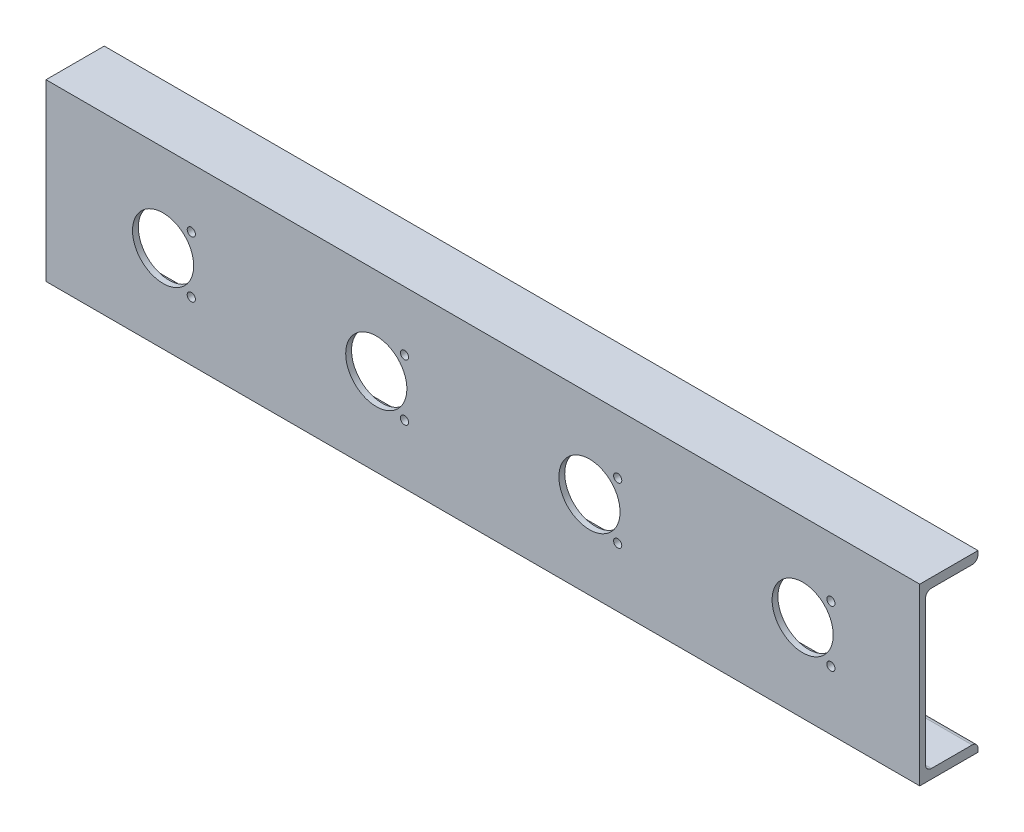
ISO-10303-21;
HEADER;
FILE_DESCRIPTION(('STEP AP214'),'2;1');
FILE_NAME('part.step','',(''),(''),'','','');
FILE_SCHEMA(('AUTOMOTIVE_DESIGN { 1 0 10303 214 1 1 1 1 }'));
ENDSEC;
DATA;
#1=APPLICATION_CONTEXT('core data for automotive mechanical design processes');
#2=APPLICATION_PROTOCOL_DEFINITION('international standard','automotive_design',2000,#1);
#3=PRODUCT_CONTEXT('',#1,'mechanical');
#4=PRODUCT('Part','Part','',(#3));
#5=PRODUCT_RELATED_PRODUCT_CATEGORY('part','',(#4));
#6=PRODUCT_DEFINITION_FORMATION('','',#4);
#7=PRODUCT_DEFINITION_CONTEXT('part definition',#1,'design');
#8=PRODUCT_DEFINITION('design','',#6,#7);
#9=PRODUCT_DEFINITION_SHAPE('','',#8);
#10=(LENGTH_UNIT() NAMED_UNIT(*) SI_UNIT(.MILLI.,.METRE.));
#11=(NAMED_UNIT(*) PLANE_ANGLE_UNIT() SI_UNIT($,.RADIAN.));
#12=(NAMED_UNIT(*) SI_UNIT($,.STERADIAN.) SOLID_ANGLE_UNIT());
#13=UNCERTAINTY_MEASURE_WITH_UNIT(LENGTH_MEASURE(1.E-05),#10,'distance_accuracy_value','');
#14=(GEOMETRIC_REPRESENTATION_CONTEXT(3) GLOBAL_UNCERTAINTY_ASSIGNED_CONTEXT((#13)) GLOBAL_UNIT_ASSIGNED_CONTEXT((#10,
#11,#12)) REPRESENTATION_CONTEXT('',''));
#15=CARTESIAN_POINT('',(0.,0.,0.));
#16=DIRECTION('',(0.,0.,1.));
#17=DIRECTION('',(1.,0.,0.));
#18=AXIS2_PLACEMENT_3D('',#15,#16,#17);
#19=CARTESIAN_POINT('',(201.,-36.1204013377926,206.622073578595));
#20=DIRECTION('',(0.,0.,-1.));
#21=DIRECTION('',(0.,1.,0.));
#22=AXIS2_PLACEMENT_3D('',#19,#20,#21);
#23=CYLINDRICAL_SURFACE('',#22,52.4999999999999);
#24=CARTESIAN_POINT('',(201.,-36.1204013377926,176.622073578595));
#25=DIRECTION('',(0.,0.,-1.));
#26=DIRECTION('',(0.,1.,0.));
#27=AXIS2_PLACEMENT_3D('',#24,#25,#26);
#28=CIRCLE('',#27,52.4999999999999);
#29=CARTESIAN_POINT('',(201.,16.3795986622073,176.622073578595));
#30=VERTEX_POINT('',#29);
#31=EDGE_CURVE('E44',#30,#30,#28,.T.);
#32=ORIENTED_EDGE('',*,*,#31,.T.);
#33=EDGE_LOOP('',(#32));
#34=FACE_BOUND('',#33,.T.);
#35=CARTESIAN_POINT('',(201.,-36.1204013377926,186.622073578595));
#36=DIRECTION('',(0.,0.,-1.));
#37=DIRECTION('',(-1.,0.,0.));
#38=AXIS2_PLACEMENT_3D('',#35,#36,#37);
#39=CIRCLE('',#38,52.4999999999999);
#40=CARTESIAN_POINT('',(148.5,-36.1204013377926,186.622073578595));
#41=VERTEX_POINT('',#40);
#42=EDGE_CURVE('E11',#41,#41,#39,.T.);
#43=ORIENTED_EDGE('',*,*,#42,.F.);
#44=EDGE_LOOP('',(#43));
#45=FACE_BOUND('',#44,.T.);
#46=ADVANCED_FACE('F35',(#34,#45),#23,.F.);
#47=CARTESIAN_POINT('',(567.,-36.1204013377926,206.622073578595));
#48=DIRECTION('',(0.,0.,-1.));
#49=DIRECTION('',(0.,1.,0.));
#50=AXIS2_PLACEMENT_3D('',#47,#48,#49);
#51=CYLINDRICAL_SURFACE('',#50,52.4999999999999);
#52=CARTESIAN_POINT('',(567.,-36.1204013377926,176.622073578595));
#53=DIRECTION('',(0.,0.,-1.));
#54=DIRECTION('',(0.,1.,0.));
#55=AXIS2_PLACEMENT_3D('',#52,#53,#54);
#56=CIRCLE('',#55,52.4999999999999);
#57=CARTESIAN_POINT('',(567.,16.3795986622073,176.622073578595));
#58=VERTEX_POINT('',#57);
#59=EDGE_CURVE('E208',#58,#58,#56,.T.);
#60=ORIENTED_EDGE('',*,*,#59,.T.);
#61=EDGE_LOOP('',(#60));
#62=FACE_BOUND('',#61,.T.);
#63=CARTESIAN_POINT('',(567.,-36.1204013377926,186.622073578595));
#64=DIRECTION('',(0.,0.,-1.));
#65=DIRECTION('',(-1.,0.,0.));
#66=AXIS2_PLACEMENT_3D('',#63,#64,#65);
#67=CIRCLE('',#66,52.4999999999999);
#68=CARTESIAN_POINT('',(514.5,-36.1204013377926,186.622073578595));
#69=VERTEX_POINT('',#68);
#70=EDGE_CURVE('E211',#69,#69,#67,.T.);
#71=ORIENTED_EDGE('',*,*,#70,.F.);
#72=EDGE_LOOP('',(#71));
#73=FACE_BOUND('',#72,.T.);
#74=ADVANCED_FACE('F314',(#62,#73),#51,.F.);
#75=CARTESIAN_POINT('',(1500.,107.879598662207,86.6220735785954));
#76=DIRECTION('',(0.,0.,1.));
#77=DIRECTION('',(1.,0.,0.));
#78=AXIS2_PLACEMENT_3D('',#75,#76,#77);
#79=PLANE('',#78);
#80=DIRECTION('',(0.,1.,0.));
#81=VECTOR('',#80,1.);
#82=CARTESIAN_POINT('',(0.,107.879598662207,86.6220735785954));
#83=LINE('',#82,#81);
#84=CARTESIAN_POINT('',(0.,107.879598662207,86.6220735785954));
#85=VERTEX_POINT('',#84);
#86=CARTESIAN_POINT('',(0.,113.879598662207,86.6220735785954));
#87=VERTEX_POINT('',#86);
#88=EDGE_CURVE('E158',#85,#87,#83,.T.);
#89=ORIENTED_EDGE('',*,*,#88,.T.);
#90=DIRECTION('',(-1.,0.,0.));
#91=VECTOR('',#90,1.);
#92=CARTESIAN_POINT('',(1500.,113.879598662207,86.6220735785954));
#93=LINE('',#92,#91);
#94=CARTESIAN_POINT('',(1500.,113.879598662207,86.6220735785954));
#95=VERTEX_POINT('',#94);
#96=EDGE_CURVE('E206',#95,#87,#93,.T.);
#97=ORIENTED_EDGE('',*,*,#96,.F.);
#98=DIRECTION('',(0.,1.,0.));
#99=VECTOR('',#98,1.);
#100=CARTESIAN_POINT('',(1500.,107.879598662207,86.6220735785954));
#101=LINE('',#100,#99);
#102=CARTESIAN_POINT('',(1500.,107.879598662207,86.6220735785954));
#103=VERTEX_POINT('',#102);
#104=EDGE_CURVE('E181',#103,#95,#101,.T.);
#105=ORIENTED_EDGE('',*,*,#104,.F.);
#106=DIRECTION('',(-1.,0.,0.));
#107=VECTOR('',#106,1.);
#108=CARTESIAN_POINT('',(1500.,107.879598662207,86.6220735785954));
#109=LINE('',#108,#107);
#110=EDGE_CURVE('E154',#103,#85,#109,.T.);
#111=ORIENTED_EDGE('',*,*,#110,.T.);
#112=EDGE_LOOP('',(#89,#97,#105,#111));
#113=FACE_BOUND('',#112,.T.);
#114=ADVANCED_FACE('F301',(#113),#79,.F.);
#115=CARTESIAN_POINT('',(1500.,113.879598662207,86.6220735785954));
#116=DIRECTION('',(0.,-1.,0.));
#117=DIRECTION('',(0.,0.,-1.));
#118=AXIS2_PLACEMENT_3D('',#115,#116,#117);
#119=PLANE('',#118);
#120=DIRECTION('',(0.,0.,1.));
#121=VECTOR('',#120,1.);
#122=CARTESIAN_POINT('',(0.,113.879598662207,86.6220735785954));
#123=LINE('',#122,#121);
#124=CARTESIAN_POINT('',(0.,113.879598662207,186.622073578595));
#125=VERTEX_POINT('',#124);
#126=EDGE_CURVE('E161',#87,#125,#123,.T.);
#127=ORIENTED_EDGE('',*,*,#126,.T.);
#128=DIRECTION('',(-1.,0.,0.));
#129=VECTOR('',#128,1.);
#130=CARTESIAN_POINT('',(1500.,113.879598662207,186.622073578595));
#131=LINE('',#130,#129);
#132=CARTESIAN_POINT('',(1500.,113.879598662207,186.622073578595));
#133=VERTEX_POINT('',#132);
#134=EDGE_CURVE('E203',#133,#125,#131,.T.);
#135=ORIENTED_EDGE('',*,*,#134,.F.);
#136=DIRECTION('',(0.,0.,1.));
#137=VECTOR('',#136,1.);
#138=CARTESIAN_POINT('',(1500.,113.879598662207,86.6220735785954));
#139=LINE('',#138,#137);
#140=EDGE_CURVE('E109',#95,#133,#139,.T.);
#141=ORIENTED_EDGE('',*,*,#140,.F.);
#142=ORIENTED_EDGE('',*,*,#96,.T.);
#143=EDGE_LOOP('',(#127,#135,#141,#142));
#144=FACE_BOUND('',#143,.T.);
#145=ADVANCED_FACE('F327',(#144),#119,.F.);
#146=CARTESIAN_POINT('',(1500.,113.879598662207,186.622073578595));
#147=DIRECTION('',(0.,0.,-1.));
#148=DIRECTION('',(-1.,0.,0.));
#149=AXIS2_PLACEMENT_3D('',#146,#147,#148);
#150=PLANE('',#149);
#151=CARTESIAN_POINT('',(249.436814511279,12.316413173486,186.622073578595));
#152=DIRECTION('',(0.,0.,-1.));
#153=DIRECTION('',(-1.,0.,0.));
#154=AXIS2_PLACEMENT_3D('',#151,#152,#153);
#155=CIRCLE('',#154,6.99999999999989);
#156=CARTESIAN_POINT('',(242.436814511279,12.316413173486,186.622073578595));
#157=VERTEX_POINT('',#156);
#158=EDGE_CURVE('E220',#157,#157,#155,.T.);
#159=ORIENTED_EDGE('',*,*,#158,.T.);
#160=EDGE_LOOP('',(#159));
#161=FACE_BOUND('',#160,.T.);
#162=CARTESIAN_POINT('',(615.436814511278,-84.5572158490712,186.622073578595));
#163=DIRECTION('',(0.,0.,-1.));
#164=DIRECTION('',(-1.,0.,0.));
#165=AXIS2_PLACEMENT_3D('',#162,#163,#164);
#166=CIRCLE('',#165,6.99999999999989);
#167=CARTESIAN_POINT('',(608.436814511279,-84.5572158490712,186.622073578595));
#168=VERTEX_POINT('',#167);
#169=EDGE_CURVE('E242',#168,#168,#166,.T.);
#170=ORIENTED_EDGE('',*,*,#169,.T.);
#171=EDGE_LOOP('',(#170));
#172=FACE_BOUND('',#171,.T.);
#173=CARTESIAN_POINT('',(615.436814511278,12.316413173486,186.622073578595));
#174=DIRECTION('',(0.,0.,-1.));
#175=DIRECTION('',(-1.,0.,0.));
#176=AXIS2_PLACEMENT_3D('',#173,#174,#175);
#177=CIRCLE('',#176,6.99999999999989);
#178=CARTESIAN_POINT('',(608.436814511279,12.316413173486,186.622073578595));
#179=VERTEX_POINT('',#178);
#180=EDGE_CURVE('E239',#179,#179,#177,.T.);
#181=ORIENTED_EDGE('',*,*,#180,.T.);
#182=EDGE_LOOP('',(#181));
#183=FACE_BOUND('',#182,.T.);
#184=CARTESIAN_POINT('',(981.436814511278,-84.5572158490712,186.622073578595));
#185=DIRECTION('',(0.,0.,-1.));
#186=DIRECTION('',(-1.,0.,0.));
#187=AXIS2_PLACEMENT_3D('',#184,#185,#186);
#188=CIRCLE('',#187,6.99999999999989);
#189=CARTESIAN_POINT('',(974.436814511279,-84.5572158490712,186.622073578595));
#190=VERTEX_POINT('',#189);
#191=EDGE_CURVE('E236',#190,#190,#188,.T.);
#192=ORIENTED_EDGE('',*,*,#191,.T.);
#193=EDGE_LOOP('',(#192));
#194=FACE_BOUND('',#193,.T.);
#195=CARTESIAN_POINT('',(249.436814511279,-84.5572158490712,186.622073578595));
#196=DIRECTION('',(0.,0.,-1.));
#197=DIRECTION('',(-1.,0.,0.));
#198=AXIS2_PLACEMENT_3D('',#195,#196,#197);
#199=CIRCLE('',#198,6.99999999999989);
#200=CARTESIAN_POINT('',(242.436814511279,-84.5572158490712,186.622073578595));
#201=VERTEX_POINT('',#200);
#202=EDGE_CURVE('E232',#201,#201,#199,.T.);
#203=ORIENTED_EDGE('',*,*,#202,.T.);
#204=EDGE_LOOP('',(#203));
#205=FACE_BOUND('',#204,.T.);
#206=CARTESIAN_POINT('',(981.436814511278,12.316413173486,186.622073578595));
#207=DIRECTION('',(0.,0.,-1.));
#208=DIRECTION('',(-1.,0.,0.));
#209=AXIS2_PLACEMENT_3D('',#206,#207,#208);
#210=CIRCLE('',#209,6.99999999999989);
#211=CARTESIAN_POINT('',(974.436814511279,12.316413173486,186.622073578595));
#212=VERTEX_POINT('',#211);
#213=EDGE_CURVE('E228',#212,#212,#210,.T.);
#214=ORIENTED_EDGE('',*,*,#213,.T.);
#215=EDGE_LOOP('',(#214));
#216=FACE_BOUND('',#215,.T.);
#217=CARTESIAN_POINT('',(1347.43681451128,12.316413173486,186.622073578595));
#218=DIRECTION('',(0.,0.,-1.));
#219=DIRECTION('',(-1.,0.,0.));
#220=AXIS2_PLACEMENT_3D('',#217,#218,#219);
#221=CIRCLE('',#220,6.99999999999989);
#222=CARTESIAN_POINT('',(1340.43681451128,12.316413173486,186.622073578595));
#223=VERTEX_POINT('',#222);
#224=EDGE_CURVE('E224',#223,#223,#221,.T.);
#225=ORIENTED_EDGE('',*,*,#224,.T.);
#226=EDGE_LOOP('',(#225));
#227=FACE_BOUND('',#226,.T.);
#228=CARTESIAN_POINT('',(1347.43681451128,-84.5572158490712,186.622073578595));
#229=DIRECTION('',(0.,0.,-1.));
#230=DIRECTION('',(-1.,0.,0.));
#231=AXIS2_PLACEMENT_3D('',#228,#229,#230);
#232=CIRCLE('',#231,6.99999999999989);
#233=CARTESIAN_POINT('',(1340.43681451128,-84.5572158490712,186.622073578595));
#234=VERTEX_POINT('',#233);
#235=EDGE_CURVE('E219',#234,#234,#232,.T.);
#236=ORIENTED_EDGE('',*,*,#235,.T.);
#237=EDGE_LOOP('',(#236));
#238=FACE_BOUND('',#237,.T.);
#239=CARTESIAN_POINT('',(933.,-36.1204013377926,186.622073578595));
#240=DIRECTION('',(0.,0.,-1.));
#241=DIRECTION('',(-1.,0.,0.));
#242=AXIS2_PLACEMENT_3D('',#239,#240,#241);
#243=CIRCLE('',#242,52.4999999999999);
#244=CARTESIAN_POINT('',(880.5,-36.1204013377926,186.622073578595));
#245=VERTEX_POINT('',#244);
#246=EDGE_CURVE('E263',#245,#245,#243,.T.);
#247=ORIENTED_EDGE('',*,*,#246,.T.);
#248=EDGE_LOOP('',(#247));
#249=FACE_BOUND('',#248,.T.);
#250=CARTESIAN_POINT('',(1299.,-36.1204013377926,186.622073578595));
#251=DIRECTION('',(0.,0.,-1.));
#252=DIRECTION('',(-1.,0.,0.));
#253=AXIS2_PLACEMENT_3D('',#250,#251,#252);
#254=CIRCLE('',#253,52.4999999999999);
#255=CARTESIAN_POINT('',(1246.5,-36.1204013377926,186.622073578595));
#256=VERTEX_POINT('',#255);
#257=EDGE_CURVE('E162',#256,#256,#254,.T.);
#258=ORIENTED_EDGE('',*,*,#257,.T.);
#259=EDGE_LOOP('',(#258));
#260=FACE_BOUND('',#259,.T.);
#261=DIRECTION('',(0.,-1.,0.));
#262=VECTOR('',#261,1.);
#263=CARTESIAN_POINT('',(0.,113.879598662207,186.622073578595));
#264=LINE('',#263,#262);
#265=CARTESIAN_POINT('',(0.,-186.120401337793,186.622073578595));
#266=VERTEX_POINT('',#265);
#267=EDGE_CURVE('E164',#125,#266,#264,.T.);
#268=ORIENTED_EDGE('',*,*,#267,.T.);
#269=DIRECTION('',(-1.,0.,0.));
#270=VECTOR('',#269,1.);
#271=CARTESIAN_POINT('',(1500.,-186.120401337793,186.622073578595));
#272=LINE('',#271,#270);
#273=CARTESIAN_POINT('',(1500.,-186.120401337793,186.622073578595));
#274=VERTEX_POINT('',#273);
#275=EDGE_CURVE('E200',#274,#266,#272,.T.);
#276=ORIENTED_EDGE('',*,*,#275,.F.);
#277=DIRECTION('',(0.,-1.,0.));
#278=VECTOR('',#277,1.);
#279=CARTESIAN_POINT('',(1500.,113.879598662207,186.622073578595));
#280=LINE('',#279,#278);
#281=EDGE_CURVE('E273',#133,#274,#280,.T.);
#282=ORIENTED_EDGE('',*,*,#281,.F.);
#283=ORIENTED_EDGE('',*,*,#134,.T.);
#284=EDGE_LOOP('',(#268,#276,#282,#283));
#285=FACE_BOUND('',#284,.T.);
#286=ORIENTED_EDGE('',*,*,#70,.T.);
#287=EDGE_LOOP('',(#286));
#288=FACE_BOUND('',#287,.T.);
#289=ORIENTED_EDGE('',*,*,#42,.T.);
#290=EDGE_LOOP('',(#289));
#291=FACE_BOUND('',#290,.T.);
#292=ADVANCED_FACE('F324',(#161,#172,#183,#194,#205,#216,#227,#238,#249,#260,#285,#288,#291),
#150,.F.);
#293=CARTESIAN_POINT('',(1500.,-186.120401337793,186.622073578595));
#294=DIRECTION('',(0.,1.,0.));
#295=DIRECTION('',(0.,0.,1.));
#296=AXIS2_PLACEMENT_3D('',#293,#294,#295);
#297=PLANE('',#296);
#298=DIRECTION('',(0.,0.,-1.));
#299=VECTOR('',#298,1.);
#300=CARTESIAN_POINT('',(0.,-186.120401337793,186.622073578595));
#301=LINE('',#300,#299);
#302=CARTESIAN_POINT('',(0.,-186.120401337793,86.6220735785954));
#303=VERTEX_POINT('',#302);
#304=EDGE_CURVE('E166',#266,#303,#301,.T.);
#305=ORIENTED_EDGE('',*,*,#304,.T.);
#306=DIRECTION('',(-1.,0.,0.));
#307=VECTOR('',#306,1.);
#308=CARTESIAN_POINT('',(1500.,-186.120401337793,86.6220735785954));
#309=LINE('',#308,#307);
#310=CARTESIAN_POINT('',(1500.,-186.120401337793,86.6220735785954));
#311=VERTEX_POINT('',#310);
#312=EDGE_CURVE('E197',#311,#303,#309,.T.);
#313=ORIENTED_EDGE('',*,*,#312,.F.);
#314=DIRECTION('',(0.,0.,-1.));
#315=VECTOR('',#314,1.);
#316=CARTESIAN_POINT('',(1500.,-186.120401337793,186.622073578595));
#317=LINE('',#316,#315);
#318=EDGE_CURVE('E275',#274,#311,#317,.T.);
#319=ORIENTED_EDGE('',*,*,#318,.F.);
#320=ORIENTED_EDGE('',*,*,#275,.T.);
#321=EDGE_LOOP('',(#305,#313,#319,#320));
#322=FACE_BOUND('',#321,.T.);
#323=ADVANCED_FACE('F326',(#322),#297,.F.);
#324=CARTESIAN_POINT('',(1500.,-186.120401337793,86.6220735785954));
#325=DIRECTION('',(0.,0.,1.));
#326=DIRECTION('',(1.,0.,0.));
#327=AXIS2_PLACEMENT_3D('',#324,#325,#326);
#328=PLANE('',#327);
#329=DIRECTION('',(0.,1.,0.));
#330=VECTOR('',#329,1.);
#331=CARTESIAN_POINT('',(0.,-186.120401337793,86.6220735785954));
#332=LINE('',#331,#330);
#333=CARTESIAN_POINT('',(0.,-180.120401337793,86.6220735785954));
#334=VERTEX_POINT('',#333);
#335=EDGE_CURVE('E168',#303,#334,#332,.T.);
#336=ORIENTED_EDGE('',*,*,#335,.T.);
#337=DIRECTION('',(-1.,0.,0.));
#338=VECTOR('',#337,1.);
#339=CARTESIAN_POINT('',(1500.,-180.120401337793,86.6220735785954));
#340=LINE('',#339,#338);
#341=CARTESIAN_POINT('',(1500.,-180.120401337793,86.6220735785954));
#342=VERTEX_POINT('',#341);
#343=EDGE_CURVE('E194',#342,#334,#340,.T.);
#344=ORIENTED_EDGE('',*,*,#343,.F.);
#345=DIRECTION('',(0.,1.,0.));
#346=VECTOR('',#345,1.);
#347=CARTESIAN_POINT('',(1500.,-186.120401337793,86.6220735785954));
#348=LINE('',#347,#346);
#349=EDGE_CURVE('E277',#311,#342,#348,.T.);
#350=ORIENTED_EDGE('',*,*,#349,.F.);
#351=ORIENTED_EDGE('',*,*,#312,.T.);
#352=EDGE_LOOP('',(#336,#344,#350,#351));
#353=FACE_BOUND('',#352,.T.);
#354=ADVANCED_FACE('F335',(#353),#328,.F.);
#355=CARTESIAN_POINT('',(1500.,-180.120401337793,96.6220735785954));
#356=DIRECTION('',(-1.,0.,0.));
#357=DIRECTION('',(0.,0.,1.));
#358=AXIS2_PLACEMENT_3D('',#355,#356,#357);
#359=CYLINDRICAL_SURFACE('',#358,10.);
#360=CARTESIAN_POINT('',(0.,-180.120401337793,96.6220735785954));
#361=DIRECTION('',(1.,0.,0.));
#362=DIRECTION('',(0.,0.,-1.));
#363=AXIS2_PLACEMENT_3D('',#360,#361,#362);
#364=CIRCLE('',#363,10.);
#365=CARTESIAN_POINT('',(0.,-170.120401337793,96.6220735785954));
#366=VERTEX_POINT('',#365);
#367=EDGE_CURVE('E170',#334,#366,#364,.T.);
#368=ORIENTED_EDGE('',*,*,#367,.T.);
#369=DIRECTION('',(-1.,0.,0.));
#370=VECTOR('',#369,1.);
#371=CARTESIAN_POINT('',(1500.,-170.120401337793,96.6220735785954));
#372=LINE('',#371,#370);
#373=CARTESIAN_POINT('',(1500.,-170.120401337793,96.6220735785954));
#374=VERTEX_POINT('',#373);
#375=EDGE_CURVE('E191',#374,#366,#372,.T.);
#376=ORIENTED_EDGE('',*,*,#375,.F.);
#377=CARTESIAN_POINT('',(1500.,-180.120401337793,96.6220735785954));
#378=DIRECTION('',(1.,0.,0.));
#379=DIRECTION('',(0.,0.,-1.));
#380=AXIS2_PLACEMENT_3D('',#377,#378,#379);
#381=CIRCLE('',#380,10.);
#382=EDGE_CURVE('E279',#342,#374,#381,.T.);
#383=ORIENTED_EDGE('',*,*,#382,.F.);
#384=ORIENTED_EDGE('',*,*,#343,.T.);
#385=EDGE_LOOP('',(#368,#376,#383,#384));
#386=FACE_BOUND('',#385,.T.);
#387=ADVANCED_FACE('F367',(#386),#359,.T.);
#388=CARTESIAN_POINT('',(1500.,-170.120401337793,96.6220735785954));
#389=DIRECTION('',(0.,-1.,0.));
#390=DIRECTION('',(0.,0.,-1.));
#391=AXIS2_PLACEMENT_3D('',#388,#389,#390);
#392=PLANE('',#391);
#393=DIRECTION('',(0.,0.,1.));
#394=VECTOR('',#393,1.);
#395=CARTESIAN_POINT('',(0.,-170.120401337793,96.6220735785954));
#396=LINE('',#395,#394);
#397=CARTESIAN_POINT('',(0.,-170.120401337793,166.622073578595));
#398=VERTEX_POINT('',#397);
#399=EDGE_CURVE('E172',#366,#398,#396,.T.);
#400=ORIENTED_EDGE('',*,*,#399,.T.);
#401=DIRECTION('',(-1.,0.,0.));
#402=VECTOR('',#401,1.);
#403=CARTESIAN_POINT('',(1500.,-170.120401337793,166.622073578595));
#404=LINE('',#403,#402);
#405=CARTESIAN_POINT('',(1500.,-170.120401337793,166.622073578595));
#406=VERTEX_POINT('',#405);
#407=EDGE_CURVE('E188',#406,#398,#404,.T.);
#408=ORIENTED_EDGE('',*,*,#407,.F.);
#409=DIRECTION('',(0.,0.,1.));
#410=VECTOR('',#409,1.);
#411=CARTESIAN_POINT('',(1500.,-170.120401337793,96.6220735785954));
#412=LINE('',#411,#410);
#413=EDGE_CURVE('E281',#374,#406,#412,.T.);
#414=ORIENTED_EDGE('',*,*,#413,.F.);
#415=ORIENTED_EDGE('',*,*,#375,.T.);
#416=EDGE_LOOP('',(#400,#408,#414,#415));
#417=FACE_BOUND('',#416,.T.);
#418=ADVANCED_FACE('F374',(#417),#392,.F.);
#419=CARTESIAN_POINT('',(1500.,-160.120401337793,166.622073578595));
#420=DIRECTION('',(-1.,0.,0.));
#421=DIRECTION('',(0.,0.,1.));
#422=AXIS2_PLACEMENT_3D('',#419,#420,#421);
#423=CYLINDRICAL_SURFACE('',#422,10.);
#424=CARTESIAN_POINT('',(0.,-160.120401337793,166.622073578595));
#425=DIRECTION('',(-1.,0.,0.));
#426=DIRECTION('',(0.,0.,1.));
#427=AXIS2_PLACEMENT_3D('',#424,#425,#426);
#428=CIRCLE('',#427,10.);
#429=CARTESIAN_POINT('',(0.,-160.120401337793,176.622073578595));
#430=VERTEX_POINT('',#429);
#431=EDGE_CURVE('E174',#398,#430,#428,.T.);
#432=ORIENTED_EDGE('',*,*,#431,.T.);
#433=DIRECTION('',(-1.,0.,0.));
#434=VECTOR('',#433,1.);
#435=CARTESIAN_POINT('',(1500.,-160.120401337793,176.622073578595));
#436=LINE('',#435,#434);
#437=CARTESIAN_POINT('',(1500.,-160.120401337793,176.622073578595));
#438=VERTEX_POINT('',#437);
#439=EDGE_CURVE('E185',#438,#430,#436,.T.);
#440=ORIENTED_EDGE('',*,*,#439,.F.);
#441=CARTESIAN_POINT('',(1500.,-160.120401337793,166.622073578595));
#442=DIRECTION('',(-1.,0.,0.));
#443=DIRECTION('',(0.,0.,1.));
#444=AXIS2_PLACEMENT_3D('',#441,#442,#443);
#445=CIRCLE('',#444,10.);
#446=EDGE_CURVE('E283',#406,#438,#445,.T.);
#447=ORIENTED_EDGE('',*,*,#446,.F.);
#448=ORIENTED_EDGE('',*,*,#407,.T.);
#449=EDGE_LOOP('',(#432,#440,#447,#448));
#450=FACE_BOUND('',#449,.T.);
#451=ADVANCED_FACE('F289',(#450),#423,.F.);
#452=CARTESIAN_POINT('',(1500.,-160.120401337793,176.622073578595));
#453=DIRECTION('',(0.,0.,1.));
#454=DIRECTION('',(0.,-1.,0.));
#455=AXIS2_PLACEMENT_3D('',#452,#453,#454);
#456=PLANE('',#455);
#457=CARTESIAN_POINT('',(249.436814511279,12.316413173486,176.622073578595));
#458=DIRECTION('',(0.,0.,1.));
#459=DIRECTION('',(0.,-1.,0.));
#460=AXIS2_PLACEMENT_3D('',#457,#458,#459);
#461=CIRCLE('',#460,6.99999999999989);
#462=CARTESIAN_POINT('',(249.436814511279,5.31641317348608,176.622073578595));
#463=VERTEX_POINT('',#462);
#464=EDGE_CURVE('E38',#463,#463,#461,.T.);
#465=ORIENTED_EDGE('',*,*,#464,.T.);
#466=EDGE_LOOP('',(#465));
#467=FACE_BOUND('',#466,.T.);
#468=CARTESIAN_POINT('',(615.436814511278,-84.5572158490712,176.622073578595));
#469=DIRECTION('',(0.,0.,1.));
#470=DIRECTION('',(0.,-1.,0.));
#471=AXIS2_PLACEMENT_3D('',#468,#469,#470);
#472=CIRCLE('',#471,6.99999999999989);
#473=CARTESIAN_POINT('',(615.436814511278,-91.5572158490711,176.622073578595));
#474=VERTEX_POINT('',#473);
#475=EDGE_CURVE('E240',#474,#474,#472,.T.);
#476=ORIENTED_EDGE('',*,*,#475,.T.);
#477=EDGE_LOOP('',(#476));
#478=FACE_BOUND('',#477,.T.);
#479=CARTESIAN_POINT('',(615.436814511278,12.316413173486,176.622073578595));
#480=DIRECTION('',(0.,0.,1.));
#481=DIRECTION('',(0.,-1.,0.));
#482=AXIS2_PLACEMENT_3D('',#479,#480,#481);
#483=CIRCLE('',#482,6.99999999999989);
#484=CARTESIAN_POINT('',(615.436814511278,5.31641317348608,176.622073578595));
#485=VERTEX_POINT('',#484);
#486=EDGE_CURVE('E237',#485,#485,#483,.T.);
#487=ORIENTED_EDGE('',*,*,#486,.T.);
#488=EDGE_LOOP('',(#487));
#489=FACE_BOUND('',#488,.T.);
#490=CARTESIAN_POINT('',(981.436814511278,-84.5572158490712,176.622073578595));
#491=DIRECTION('',(0.,0.,1.));
#492=DIRECTION('',(0.,-1.,0.));
#493=AXIS2_PLACEMENT_3D('',#490,#491,#492);
#494=CIRCLE('',#493,6.99999999999989);
#495=CARTESIAN_POINT('',(981.436814511278,-91.5572158490711,176.622073578595));
#496=VERTEX_POINT('',#495);
#497=EDGE_CURVE('E233',#496,#496,#494,.T.);
#498=ORIENTED_EDGE('',*,*,#497,.T.);
#499=EDGE_LOOP('',(#498));
#500=FACE_BOUND('',#499,.T.);
#501=CARTESIAN_POINT('',(249.436814511279,-84.5572158490712,176.622073578595));
#502=DIRECTION('',(0.,0.,1.));
#503=DIRECTION('',(0.,-1.,0.));
#504=AXIS2_PLACEMENT_3D('',#501,#502,#503);
#505=CIRCLE('',#504,6.99999999999989);
#506=CARTESIAN_POINT('',(249.436814511279,-91.5572158490711,176.622073578595));
#507=VERTEX_POINT('',#506);
#508=EDGE_CURVE('E229',#507,#507,#505,.T.);
#509=ORIENTED_EDGE('',*,*,#508,.T.);
#510=EDGE_LOOP('',(#509));
#511=FACE_BOUND('',#510,.T.);
#512=CARTESIAN_POINT('',(981.436814511278,12.316413173486,176.622073578595));
#513=DIRECTION('',(0.,0.,1.));
#514=DIRECTION('',(0.,-1.,0.));
#515=AXIS2_PLACEMENT_3D('',#512,#513,#514);
#516=CIRCLE('',#515,6.99999999999989);
#517=CARTESIAN_POINT('',(981.436814511278,5.31641317348608,176.622073578595));
#518=VERTEX_POINT('',#517);
#519=EDGE_CURVE('E225',#518,#518,#516,.T.);
#520=ORIENTED_EDGE('',*,*,#519,.T.);
#521=EDGE_LOOP('',(#520));
#522=FACE_BOUND('',#521,.T.);
#523=CARTESIAN_POINT('',(1347.43681451128,12.316413173486,176.622073578595));
#524=DIRECTION('',(0.,0.,1.));
#525=DIRECTION('',(0.,-1.,0.));
#526=AXIS2_PLACEMENT_3D('',#523,#524,#525);
#527=CIRCLE('',#526,6.99999999999989);
#528=CARTESIAN_POINT('',(1347.43681451128,5.31641317348608,176.622073578595));
#529=VERTEX_POINT('',#528);
#530=EDGE_CURVE('E221',#529,#529,#527,.T.);
#531=ORIENTED_EDGE('',*,*,#530,.T.);
#532=EDGE_LOOP('',(#531));
#533=FACE_BOUND('',#532,.T.);
#534=CARTESIAN_POINT('',(1347.43681451128,-84.5572158490712,176.622073578595));
#535=DIRECTION('',(0.,0.,1.));
#536=DIRECTION('',(0.,-1.,0.));
#537=AXIS2_PLACEMENT_3D('',#534,#535,#536);
#538=CIRCLE('',#537,6.99999999999989);
#539=CARTESIAN_POINT('',(1347.43681451128,-91.5572158490711,176.622073578595));
#540=VERTEX_POINT('',#539);
#541=EDGE_CURVE('E216',#540,#540,#538,.T.);
#542=ORIENTED_EDGE('',*,*,#541,.T.);
#543=EDGE_LOOP('',(#542));
#544=FACE_BOUND('',#543,.T.);
#545=CARTESIAN_POINT('',(933.,-36.1204013377926,176.622073578595));
#546=DIRECTION('',(0.,0.,-1.));
#547=DIRECTION('',(0.,1.,0.));
#548=AXIS2_PLACEMENT_3D('',#545,#546,#547);
#549=CIRCLE('',#548,52.4999999999999);
#550=CARTESIAN_POINT('',(933.,16.3795986622073,176.622073578595));
#551=VERTEX_POINT('',#550);
#552=EDGE_CURVE('E260',#551,#551,#549,.T.);
#553=ORIENTED_EDGE('',*,*,#552,.F.);
#554=EDGE_LOOP('',(#553));
#555=FACE_BOUND('',#554,.T.);
#556=CARTESIAN_POINT('',(1299.,-36.1204013377926,176.622073578595));
#557=DIRECTION('',(0.,0.,-1.));
#558=DIRECTION('',(0.,1.,0.));
#559=AXIS2_PLACEMENT_3D('',#556,#557,#558);
#560=CIRCLE('',#559,52.4999999999999);
#561=CARTESIAN_POINT('',(1299.,16.3795986622073,176.622073578595));
#562=VERTEX_POINT('',#561);
#563=EDGE_CURVE('E266',#562,#562,#560,.T.);
#564=ORIENTED_EDGE('',*,*,#563,.F.);
#565=EDGE_LOOP('',(#564));
#566=FACE_BOUND('',#565,.T.);
#567=DIRECTION('',(0.,1.,0.));
#568=VECTOR('',#567,1.);
#569=CARTESIAN_POINT('',(0.,-160.120401337793,176.622073578595));
#570=LINE('',#569,#568);
#571=CARTESIAN_POINT('',(0.,87.8795986622073,176.622073578595));
#572=VERTEX_POINT('',#571);
#573=EDGE_CURVE('E176',#430,#572,#570,.T.);
#574=ORIENTED_EDGE('',*,*,#573,.T.);
#575=DIRECTION('',(-1.,0.,0.));
#576=VECTOR('',#575,1.);
#577=CARTESIAN_POINT('',(1500.,87.8795986622073,176.622073578595));
#578=LINE('',#577,#576);
#579=CARTESIAN_POINT('',(1500.,87.8795986622073,176.622073578595));
#580=VERTEX_POINT('',#579);
#581=EDGE_CURVE('E149',#580,#572,#578,.T.);
#582=ORIENTED_EDGE('',*,*,#581,.F.);
#583=DIRECTION('',(0.,1.,0.));
#584=VECTOR('',#583,1.);
#585=CARTESIAN_POINT('',(1500.,-160.120401337793,176.622073578595));
#586=LINE('',#585,#584);
#587=EDGE_CURVE('E140',#438,#580,#586,.T.);
#588=ORIENTED_EDGE('',*,*,#587,.F.);
#589=ORIENTED_EDGE('',*,*,#439,.T.);
#590=EDGE_LOOP('',(#574,#582,#588,#589));
#591=FACE_BOUND('',#590,.T.);
#592=ORIENTED_EDGE('',*,*,#59,.F.);
#593=EDGE_LOOP('',(#592));
#594=FACE_BOUND('',#593,.T.);
#595=ORIENTED_EDGE('',*,*,#31,.F.);
#596=EDGE_LOOP('',(#595));
#597=FACE_BOUND('',#596,.T.);
#598=ADVANCED_FACE('F293',(#467,#478,#489,#500,#511,#522,#533,#544,#555,#566,#591,#594,#597),
#456,.F.);
#599=CARTESIAN_POINT('',(1500.,87.8795986622074,166.622073578595));
#600=DIRECTION('',(-1.,0.,0.));
#601=DIRECTION('',(0.,0.,1.));
#602=AXIS2_PLACEMENT_3D('',#599,#600,#601);
#603=CYLINDRICAL_SURFACE('',#602,10.);
#604=CARTESIAN_POINT('',(0.,87.8795986622074,166.622073578595));
#605=DIRECTION('',(-1.,0.,0.));
#606=DIRECTION('',(0.,0.,1.));
#607=AXIS2_PLACEMENT_3D('',#604,#605,#606);
#608=CIRCLE('',#607,10.);
#609=CARTESIAN_POINT('',(0.,97.8795986622074,166.622073578595));
#610=VERTEX_POINT('',#609);
#611=EDGE_CURVE('E148',#572,#610,#608,.T.);
#612=ORIENTED_EDGE('',*,*,#611,.T.);
#613=DIRECTION('',(-1.,0.,0.));
#614=VECTOR('',#613,1.);
#615=CARTESIAN_POINT('',(1500.,97.8795986622074,166.622073578595));
#616=LINE('',#615,#614);
#617=CARTESIAN_POINT('',(1500.,97.8795986622074,166.622073578595));
#618=VERTEX_POINT('',#617);
#619=EDGE_CURVE('E145',#618,#610,#616,.T.);
#620=ORIENTED_EDGE('',*,*,#619,.F.);
#621=CARTESIAN_POINT('',(1500.,87.8795986622074,166.622073578595));
#622=DIRECTION('',(-1.,0.,0.));
#623=DIRECTION('',(0.,0.,1.));
#624=AXIS2_PLACEMENT_3D('',#621,#622,#623);
#625=CIRCLE('',#624,10.);
#626=EDGE_CURVE('E134',#580,#618,#625,.T.);
#627=ORIENTED_EDGE('',*,*,#626,.F.);
#628=ORIENTED_EDGE('',*,*,#581,.T.);
#629=EDGE_LOOP('',(#612,#620,#627,#628));
#630=FACE_BOUND('',#629,.T.);
#631=ADVANCED_FACE('F146',(#630),#603,.F.);
#632=CARTESIAN_POINT('',(1500.,97.8795986622074,166.622073578595));
#633=DIRECTION('',(0.,1.,0.));
#634=DIRECTION('',(0.,0.,1.));
#635=AXIS2_PLACEMENT_3D('',#632,#633,#634);
#636=PLANE('',#635);
#637=DIRECTION('',(0.,0.,-1.));
#638=VECTOR('',#637,1.);
#639=CARTESIAN_POINT('',(0.,97.8795986622074,166.622073578595));
#640=LINE('',#639,#638);
#641=CARTESIAN_POINT('',(0.,97.8795986622074,96.6220735785955));
#642=VERTEX_POINT('',#641);
#643=EDGE_CURVE('E94',#610,#642,#640,.T.);
#644=ORIENTED_EDGE('',*,*,#643,.T.);
#645=DIRECTION('',(-1.,0.,0.));
#646=VECTOR('',#645,1.);
#647=CARTESIAN_POINT('',(1500.,97.8795986622074,96.6220735785955));
#648=LINE('',#647,#646);
#649=CARTESIAN_POINT('',(1500.,97.8795986622074,96.6220735785955));
#650=VERTEX_POINT('',#649);
#651=EDGE_CURVE('E150',#650,#642,#648,.T.);
#652=ORIENTED_EDGE('',*,*,#651,.F.);
#653=DIRECTION('',(0.,0.,-1.));
#654=VECTOR('',#653,1.);
#655=CARTESIAN_POINT('',(1500.,97.8795986622074,166.622073578595));
#656=LINE('',#655,#654);
#657=EDGE_CURVE('E138',#618,#650,#656,.T.);
#658=ORIENTED_EDGE('',*,*,#657,.F.);
#659=ORIENTED_EDGE('',*,*,#619,.T.);
#660=EDGE_LOOP('',(#644,#652,#658,#659));
#661=FACE_BOUND('',#660,.T.);
#662=ADVANCED_FACE('F152',(#661),#636,.F.);
#663=CARTESIAN_POINT('',(1500.,107.879598662207,96.6220735785954));
#664=DIRECTION('',(-1.,0.,0.));
#665=DIRECTION('',(0.,0.,1.));
#666=AXIS2_PLACEMENT_3D('',#663,#664,#665);
#667=CYLINDRICAL_SURFACE('',#666,9.99999999999999);
#668=CARTESIAN_POINT('',(0.,107.879598662207,96.6220735785954));
#669=DIRECTION('',(1.,0.,0.));
#670=DIRECTION('',(0.,0.,-1.));
#671=AXIS2_PLACEMENT_3D('',#668,#669,#670);
#672=CIRCLE('',#671,9.99999999999999);
#673=EDGE_CURVE('E100',#642,#85,#672,.T.);
#674=ORIENTED_EDGE('',*,*,#673,.T.);
#675=ORIENTED_EDGE('',*,*,#110,.F.);
#676=CARTESIAN_POINT('',(1500.,107.879598662207,96.6220735785954));
#677=DIRECTION('',(1.,0.,0.));
#678=DIRECTION('',(0.,0.,-1.));
#679=AXIS2_PLACEMENT_3D('',#676,#677,#678);
#680=CIRCLE('',#679,9.99999999999999);
#681=EDGE_CURVE('E53',#650,#103,#680,.T.);
#682=ORIENTED_EDGE('',*,*,#681,.F.);
#683=ORIENTED_EDGE('',*,*,#651,.T.);
#684=EDGE_LOOP('',(#674,#675,#682,#683));
#685=FACE_BOUND('',#684,.T.);
#686=ADVANCED_FACE('F303',(#685),#667,.T.);
#687=CARTESIAN_POINT('',(1500.,-180.120401337793,96.6220735785954));
#688=DIRECTION('',(1.,0.,0.));
#689=DIRECTION('',(0.,0.,-1.));
#690=AXIS2_PLACEMENT_3D('',#687,#688,#689);
#691=PLANE('',#690);
#692=ORIENTED_EDGE('',*,*,#104,.T.);
#693=ORIENTED_EDGE('',*,*,#140,.T.);
#694=ORIENTED_EDGE('',*,*,#281,.T.);
#695=ORIENTED_EDGE('',*,*,#318,.T.);
#696=ORIENTED_EDGE('',*,*,#349,.T.);
#697=ORIENTED_EDGE('',*,*,#382,.T.);
#698=ORIENTED_EDGE('',*,*,#413,.T.);
#699=ORIENTED_EDGE('',*,*,#446,.T.);
#700=ORIENTED_EDGE('',*,*,#587,.T.);
#701=ORIENTED_EDGE('',*,*,#626,.T.);
#702=ORIENTED_EDGE('',*,*,#657,.T.);
#703=ORIENTED_EDGE('',*,*,#681,.T.);
#704=EDGE_LOOP('',(#692,#693,#694,#695,#696,#697,#698,#699,#700,#701,#702,#703));
#705=FACE_BOUND('',#704,.T.);
#706=ADVANCED_FACE('F136',(#705),#691,.T.);
#707=CARTESIAN_POINT('',(0.,-180.120401337793,96.6220735785954));
#708=DIRECTION('',(1.,0.,0.));
#709=DIRECTION('',(0.,0.,-1.));
#710=AXIS2_PLACEMENT_3D('',#707,#708,#709);
#711=PLANE('',#710);
#712=ORIENTED_EDGE('',*,*,#88,.F.);
#713=ORIENTED_EDGE('',*,*,#673,.F.);
#714=ORIENTED_EDGE('',*,*,#643,.F.);
#715=ORIENTED_EDGE('',*,*,#611,.F.);
#716=ORIENTED_EDGE('',*,*,#573,.F.);
#717=ORIENTED_EDGE('',*,*,#431,.F.);
#718=ORIENTED_EDGE('',*,*,#399,.F.);
#719=ORIENTED_EDGE('',*,*,#367,.F.);
#720=ORIENTED_EDGE('',*,*,#335,.F.);
#721=ORIENTED_EDGE('',*,*,#304,.F.);
#722=ORIENTED_EDGE('',*,*,#267,.F.);
#723=ORIENTED_EDGE('',*,*,#126,.F.);
#724=EDGE_LOOP('',(#712,#713,#714,#715,#716,#717,#718,#719,#720,#721,#722,#723));
#725=FACE_BOUND('',#724,.T.);
#726=ADVANCED_FACE('F297',(#725),#711,.F.);
#727=CARTESIAN_POINT('',(1299.,-36.1204013377926,206.622073578595));
#728=DIRECTION('',(0.,0.,-1.));
#729=DIRECTION('',(0.,1.,0.));
#730=AXIS2_PLACEMENT_3D('',#727,#728,#729);
#731=CYLINDRICAL_SURFACE('',#730,52.4999999999999);
#732=ORIENTED_EDGE('',*,*,#563,.T.);
#733=EDGE_LOOP('',(#732));
#734=FACE_BOUND('',#733,.T.);
#735=ORIENTED_EDGE('',*,*,#257,.F.);
#736=EDGE_LOOP('',(#735));
#737=FACE_BOUND('',#736,.T.);
#738=ADVANCED_FACE('F427',(#734,#737),#731,.F.);
#739=CARTESIAN_POINT('',(933.,-36.1204013377926,206.622073578595));
#740=DIRECTION('',(0.,0.,-1.));
#741=DIRECTION('',(0.,1.,0.));
#742=AXIS2_PLACEMENT_3D('',#739,#740,#741);
#743=CYLINDRICAL_SURFACE('',#742,52.4999999999999);
#744=ORIENTED_EDGE('',*,*,#552,.T.);
#745=EDGE_LOOP('',(#744));
#746=FACE_BOUND('',#745,.T.);
#747=ORIENTED_EDGE('',*,*,#246,.F.);
#748=EDGE_LOOP('',(#747));
#749=FACE_BOUND('',#748,.T.);
#750=ADVANCED_FACE('F434',(#746,#749),#743,.F.);
#751=CARTESIAN_POINT('',(1347.43681451128,-84.5572158490712,86.6220735785954));
#752=DIRECTION('',(0.,0.,1.));
#753=DIRECTION('',(1.,0.,0.));
#754=AXIS2_PLACEMENT_3D('',#751,#752,#753);
#755=CYLINDRICAL_SURFACE('',#754,6.99999999999989);
#756=ORIENTED_EDGE('',*,*,#541,.F.);
#757=EDGE_LOOP('',(#756));
#758=FACE_BOUND('',#757,.T.);
#759=ORIENTED_EDGE('',*,*,#235,.F.);
#760=EDGE_LOOP('',(#759));
#761=FACE_BOUND('',#760,.T.);
#762=ADVANCED_FACE('F453',(#758,#761),#755,.F.);
#763=CARTESIAN_POINT('',(1347.43681451128,12.316413173486,86.6220735785954));
#764=DIRECTION('',(0.,0.,1.));
#765=DIRECTION('',(1.,0.,0.));
#766=AXIS2_PLACEMENT_3D('',#763,#764,#765);
#767=CYLINDRICAL_SURFACE('',#766,6.99999999999989);
#768=ORIENTED_EDGE('',*,*,#530,.F.);
#769=EDGE_LOOP('',(#768));
#770=FACE_BOUND('',#769,.T.);
#771=ORIENTED_EDGE('',*,*,#224,.F.);
#772=EDGE_LOOP('',(#771));
#773=FACE_BOUND('',#772,.T.);
#774=ADVANCED_FACE('F462',(#770,#773),#767,.F.);
#775=CARTESIAN_POINT('',(981.436814511278,12.316413173486,86.6220735785954));
#776=DIRECTION('',(0.,0.,1.));
#777=DIRECTION('',(1.,0.,0.));
#778=AXIS2_PLACEMENT_3D('',#775,#776,#777);
#779=CYLINDRICAL_SURFACE('',#778,6.99999999999989);
#780=ORIENTED_EDGE('',*,*,#519,.F.);
#781=EDGE_LOOP('',(#780));
#782=FACE_BOUND('',#781,.T.);
#783=ORIENTED_EDGE('',*,*,#213,.F.);
#784=EDGE_LOOP('',(#783));
#785=FACE_BOUND('',#784,.T.);
#786=ADVANCED_FACE('F471',(#782,#785),#779,.F.);
#787=CARTESIAN_POINT('',(249.436814511279,-84.5572158490712,86.6220735785954));
#788=DIRECTION('',(0.,0.,1.));
#789=DIRECTION('',(1.,0.,0.));
#790=AXIS2_PLACEMENT_3D('',#787,#788,#789);
#791=CYLINDRICAL_SURFACE('',#790,6.99999999999989);
#792=ORIENTED_EDGE('',*,*,#508,.F.);
#793=EDGE_LOOP('',(#792));
#794=FACE_BOUND('',#793,.T.);
#795=ORIENTED_EDGE('',*,*,#202,.F.);
#796=EDGE_LOOP('',(#795));
#797=FACE_BOUND('',#796,.T.);
#798=ADVANCED_FACE('F481',(#794,#797),#791,.F.);
#799=CARTESIAN_POINT('',(981.436814511278,-84.5572158490712,86.6220735785954));
#800=DIRECTION('',(0.,0.,1.));
#801=DIRECTION('',(1.,0.,0.));
#802=AXIS2_PLACEMENT_3D('',#799,#800,#801);
#803=CYLINDRICAL_SURFACE('',#802,6.99999999999989);
#804=ORIENTED_EDGE('',*,*,#497,.F.);
#805=EDGE_LOOP('',(#804));
#806=FACE_BOUND('',#805,.T.);
#807=ORIENTED_EDGE('',*,*,#191,.F.);
#808=EDGE_LOOP('',(#807));
#809=FACE_BOUND('',#808,.T.);
#810=ADVANCED_FACE('F488',(#806,#809),#803,.F.);
#811=CARTESIAN_POINT('',(615.436814511278,12.316413173486,86.6220735785954));
#812=DIRECTION('',(0.,0.,1.));
#813=DIRECTION('',(1.,0.,0.));
#814=AXIS2_PLACEMENT_3D('',#811,#812,#813);
#815=CYLINDRICAL_SURFACE('',#814,6.99999999999989);
#816=ORIENTED_EDGE('',*,*,#486,.F.);
#817=EDGE_LOOP('',(#816));
#818=FACE_BOUND('',#817,.T.);
#819=ORIENTED_EDGE('',*,*,#180,.F.);
#820=EDGE_LOOP('',(#819));
#821=FACE_BOUND('',#820,.T.);
#822=ADVANCED_FACE('F496',(#818,#821),#815,.F.);
#823=CARTESIAN_POINT('',(615.436814511278,-84.5572158490712,86.6220735785954));
#824=DIRECTION('',(0.,0.,1.));
#825=DIRECTION('',(1.,0.,0.));
#826=AXIS2_PLACEMENT_3D('',#823,#824,#825);
#827=CYLINDRICAL_SURFACE('',#826,6.99999999999989);
#828=ORIENTED_EDGE('',*,*,#475,.F.);
#829=EDGE_LOOP('',(#828));
#830=FACE_BOUND('',#829,.T.);
#831=ORIENTED_EDGE('',*,*,#169,.F.);
#832=EDGE_LOOP('',(#831));
#833=FACE_BOUND('',#832,.T.);
#834=ADVANCED_FACE('F504',(#830,#833),#827,.F.);
#835=CARTESIAN_POINT('',(249.436814511279,12.316413173486,86.6220735785954));
#836=DIRECTION('',(0.,0.,1.));
#837=DIRECTION('',(1.,0.,0.));
#838=AXIS2_PLACEMENT_3D('',#835,#836,#837);
#839=CYLINDRICAL_SURFACE('',#838,6.99999999999989);
#840=ORIENTED_EDGE('',*,*,#464,.F.);
#841=EDGE_LOOP('',(#840));
#842=FACE_BOUND('',#841,.T.);
#843=ORIENTED_EDGE('',*,*,#158,.F.);
#844=EDGE_LOOP('',(#843));
#845=FACE_BOUND('',#844,.T.);
#846=ADVANCED_FACE('F512',(#842,#845),#839,.F.);
#847=CLOSED_SHELL('',(#46,#74,#114,#145,#292,#323,#354,#387,#418,#451,#598,#631,#662,#686,#706,
#726,#738,#750,#762,#774,#786,#798,#810,#822,#834,#846));
#848=MANIFOLD_SOLID_BREP('B2',#847);
#849=ADVANCED_BREP_SHAPE_REPRESENTATION('',(#18,#848),#14);
#850=SHAPE_DEFINITION_REPRESENTATION(#9,#849);
ENDSEC;
END-ISO-10303-21;
